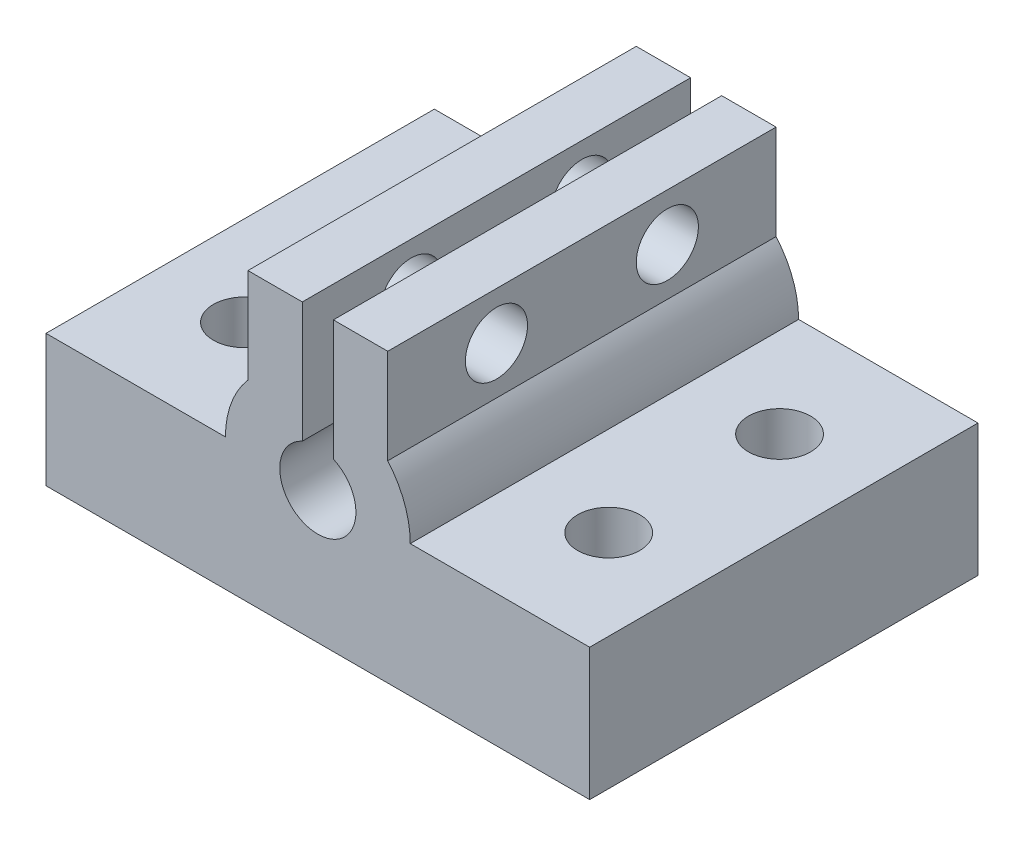
ISO-10303-21;
HEADER;
FILE_DESCRIPTION(('STEP AP214'),'2;1');
FILE_NAME('part.step','',(''),(''),'','','');
FILE_SCHEMA(('AUTOMOTIVE_DESIGN { 1 0 10303 214 1 1 1 1 }'));
ENDSEC;
DATA;
#1=APPLICATION_CONTEXT('core data for automotive mechanical design processes');
#2=APPLICATION_PROTOCOL_DEFINITION('international standard','automotive_design',2000,#1);
#3=PRODUCT_CONTEXT('',#1,'mechanical');
#4=PRODUCT('Part','Part','',(#3));
#5=PRODUCT_RELATED_PRODUCT_CATEGORY('part','',(#4));
#6=PRODUCT_DEFINITION_FORMATION('','',#4);
#7=PRODUCT_DEFINITION_CONTEXT('part definition',#1,'design');
#8=PRODUCT_DEFINITION('design','',#6,#7);
#9=PRODUCT_DEFINITION_SHAPE('','',#8);
#10=(LENGTH_UNIT() NAMED_UNIT(*) SI_UNIT(.MILLI.,.METRE.));
#11=(NAMED_UNIT(*) PLANE_ANGLE_UNIT() SI_UNIT($,.RADIAN.));
#12=(NAMED_UNIT(*) SI_UNIT($,.STERADIAN.) SOLID_ANGLE_UNIT());
#13=UNCERTAINTY_MEASURE_WITH_UNIT(LENGTH_MEASURE(1.E-05),#10,'distance_accuracy_value','');
#14=(GEOMETRIC_REPRESENTATION_CONTEXT(3) GLOBAL_UNCERTAINTY_ASSIGNED_CONTEXT((#13)) GLOBAL_UNIT_ASSIGNED_CONTEXT((#10,
#11,#12)) REPRESENTATION_CONTEXT('',''));
#15=CARTESIAN_POINT('',(0.,0.,0.));
#16=DIRECTION('',(0.,0.,1.));
#17=DIRECTION('',(1.,0.,0.));
#18=AXIS2_PLACEMENT_3D('',#15,#16,#17);
#19=CARTESIAN_POINT('',(0.,8.5,25.));
#20=DIRECTION('',(1.,0.,0.));
#21=DIRECTION('',(0.,1.,0.));
#22=AXIS2_PLACEMENT_3D('',#19,#20,#21);
#23=PLANE('',#22);
#24=DIRECTION('',(0.,-1.,0.));
#25=VECTOR('',#24,1.);
#26=CARTESIAN_POINT('',(0.,8.5,0.));
#27=LINE('',#26,#25);
#28=CARTESIAN_POINT('',(0.,8.5,0.));
#29=VERTEX_POINT('',#28);
#30=CARTESIAN_POINT('',(0.,0.,0.));
#31=VERTEX_POINT('',#30);
#32=EDGE_CURVE('E165',#29,#31,#27,.T.);
#33=ORIENTED_EDGE('',*,*,#32,.T.);
#34=DIRECTION('',(0.,0.,-1.));
#35=VECTOR('',#34,1.);
#36=CARTESIAN_POINT('',(0.,0.,25.));
#37=LINE('',#36,#35);
#38=CARTESIAN_POINT('',(0.,0.,25.));
#39=VERTEX_POINT('',#38);
#40=EDGE_CURVE('E11',#39,#31,#37,.T.);
#41=ORIENTED_EDGE('',*,*,#40,.F.);
#42=DIRECTION('',(0.,-1.,0.));
#43=VECTOR('',#42,1.);
#44=CARTESIAN_POINT('',(0.,8.5,25.));
#45=LINE('',#44,#43);
#46=CARTESIAN_POINT('',(0.,8.5,25.));
#47=VERTEX_POINT('',#46);
#48=EDGE_CURVE('E192',#47,#39,#45,.T.);
#49=ORIENTED_EDGE('',*,*,#48,.F.);
#50=DIRECTION('',(0.,0.,-1.));
#51=VECTOR('',#50,1.);
#52=CARTESIAN_POINT('',(0.,8.5,25.));
#53=LINE('',#52,#51);
#54=EDGE_CURVE('E161',#47,#29,#53,.T.);
#55=ORIENTED_EDGE('',*,*,#54,.T.);
#56=EDGE_LOOP('',(#33,#41,#49,#55));
#57=FACE_BOUND('',#56,.T.);
#58=ADVANCED_FACE('F33',(#57),#23,.F.);
#59=CARTESIAN_POINT('',(0.,0.,25.));
#60=DIRECTION('',(0.,1.,0.));
#61=DIRECTION('',(0.,0.,1.));
#62=AXIS2_PLACEMENT_3D('',#59,#60,#61);
#63=PLANE('',#62);
#64=CARTESIAN_POINT('',(5.775,0.,18.));
#65=DIRECTION('',(0.,1.,0.));
#66=DIRECTION('',(0.,0.,1.));
#67=AXIS2_PLACEMENT_3D('',#64,#65,#66);
#68=CIRCLE('',#67,2.);
#69=CARTESIAN_POINT('',(5.775,0.,20.));
#70=VERTEX_POINT('',#69);
#71=EDGE_CURVE('E461',#70,#70,#68,.F.);
#72=ORIENTED_EDGE('',*,*,#71,.F.);
#73=EDGE_LOOP('',(#72));
#74=FACE_BOUND('',#73,.T.);
#75=CARTESIAN_POINT('',(5.775,0.,7.));
#76=DIRECTION('',(0.,1.,0.));
#77=DIRECTION('',(0.,0.,1.));
#78=AXIS2_PLACEMENT_3D('',#75,#76,#77);
#79=CIRCLE('',#78,2.);
#80=CARTESIAN_POINT('',(5.775,0.,9.));
#81=VERTEX_POINT('',#80);
#82=EDGE_CURVE('E465',#81,#81,#79,.F.);
#83=ORIENTED_EDGE('',*,*,#82,.F.);
#84=EDGE_LOOP('',(#83));
#85=FACE_BOUND('',#84,.T.);
#86=CARTESIAN_POINT('',(29.225,0.,7.));
#87=DIRECTION('',(0.,1.,0.));
#88=DIRECTION('',(0.,0.,1.));
#89=AXIS2_PLACEMENT_3D('',#86,#87,#88);
#90=CIRCLE('',#89,2.);
#91=CARTESIAN_POINT('',(29.225,0.,9.));
#92=VERTEX_POINT('',#91);
#93=EDGE_CURVE('E474',#92,#92,#90,.F.);
#94=ORIENTED_EDGE('',*,*,#93,.F.);
#95=EDGE_LOOP('',(#94));
#96=FACE_BOUND('',#95,.T.);
#97=CARTESIAN_POINT('',(29.225,0.,18.));
#98=DIRECTION('',(0.,1.,0.));
#99=DIRECTION('',(0.,0.,1.));
#100=AXIS2_PLACEMENT_3D('',#97,#98,#99);
#101=CIRCLE('',#100,2.);
#102=CARTESIAN_POINT('',(29.225,0.,20.));
#103=VERTEX_POINT('',#102);
#104=EDGE_CURVE('E480',#103,#103,#101,.F.);
#105=ORIENTED_EDGE('',*,*,#104,.F.);
#106=EDGE_LOOP('',(#105));
#107=FACE_BOUND('',#106,.T.);
#108=DIRECTION('',(1.,0.,0.));
#109=VECTOR('',#108,1.);
#110=CARTESIAN_POINT('',(0.,0.,0.));
#111=LINE('',#110,#109);
#112=CARTESIAN_POINT('',(35.,0.,0.));
#113=VERTEX_POINT('',#112);
#114=EDGE_CURVE('E168',#31,#113,#111,.T.);
#115=ORIENTED_EDGE('',*,*,#114,.T.);
#116=DIRECTION('',(0.,0.,-1.));
#117=VECTOR('',#116,1.);
#118=CARTESIAN_POINT('',(35.,0.,25.));
#119=LINE('',#118,#117);
#120=CARTESIAN_POINT('',(35.,0.,25.));
#121=VERTEX_POINT('',#120);
#122=EDGE_CURVE('E41',#121,#113,#119,.T.);
#123=ORIENTED_EDGE('',*,*,#122,.F.);
#124=DIRECTION('',(1.,0.,0.));
#125=VECTOR('',#124,1.);
#126=CARTESIAN_POINT('',(0.,0.,25.));
#127=LINE('',#126,#125);
#128=EDGE_CURVE('E110',#39,#121,#127,.T.);
#129=ORIENTED_EDGE('',*,*,#128,.F.);
#130=ORIENTED_EDGE('',*,*,#40,.T.);
#131=EDGE_LOOP('',(#115,#123,#129,#130));
#132=FACE_BOUND('',#131,.T.);
#133=ADVANCED_FACE('F283',(#74,#85,#96,#107,#132),#63,.F.);
#134=CARTESIAN_POINT('',(35.,0.,25.));
#135=DIRECTION('',(-1.,0.,0.));
#136=DIRECTION('',(0.,0.,1.));
#137=AXIS2_PLACEMENT_3D('',#134,#135,#136);
#138=PLANE('',#137);
#139=DIRECTION('',(0.,1.,0.));
#140=VECTOR('',#139,1.);
#141=CARTESIAN_POINT('',(35.,0.,0.));
#142=LINE('',#141,#140);
#143=CARTESIAN_POINT('',(35.,8.5,0.));
#144=VERTEX_POINT('',#143);
#145=EDGE_CURVE('E171',#113,#144,#142,.T.);
#146=ORIENTED_EDGE('',*,*,#145,.T.);
#147=DIRECTION('',(0.,0.,-1.));
#148=VECTOR('',#147,1.);
#149=CARTESIAN_POINT('',(35.,8.5,25.));
#150=LINE('',#149,#148);
#151=CARTESIAN_POINT('',(35.,8.5,25.));
#152=VERTEX_POINT('',#151);
#153=EDGE_CURVE('E217',#152,#144,#150,.T.);
#154=ORIENTED_EDGE('',*,*,#153,.F.);
#155=DIRECTION('',(0.,1.,0.));
#156=VECTOR('',#155,1.);
#157=CARTESIAN_POINT('',(35.,0.,25.));
#158=LINE('',#157,#156);
#159=EDGE_CURVE('E225',#121,#152,#158,.T.);
#160=ORIENTED_EDGE('',*,*,#159,.F.);
#161=ORIENTED_EDGE('',*,*,#122,.T.);
#162=EDGE_LOOP('',(#146,#154,#160,#161));
#163=FACE_BOUND('',#162,.T.);
#164=ADVANCED_FACE('F223',(#163),#138,.F.);
#165=CARTESIAN_POINT('',(35.,8.5,25.));
#166=DIRECTION('',(0.,-1.,0.));
#167=DIRECTION('',(1.,0.,0.));
#168=AXIS2_PLACEMENT_3D('',#165,#166,#167);
#169=PLANE('',#168);
#170=CARTESIAN_POINT('',(29.225,8.5,7.));
#171=DIRECTION('',(0.,1.,0.));
#172=DIRECTION('',(-1.,0.,0.));
#173=AXIS2_PLACEMENT_3D('',#170,#171,#172);
#174=CIRCLE('',#173,2.);
#175=CARTESIAN_POINT('',(27.225,8.5,7.));
#176=VERTEX_POINT('',#175);
#177=EDGE_CURVE('E471',#176,#176,#174,.T.);
#178=ORIENTED_EDGE('',*,*,#177,.F.);
#179=EDGE_LOOP('',(#178));
#180=FACE_BOUND('',#179,.T.);
#181=CARTESIAN_POINT('',(29.225,8.5,18.));
#182=DIRECTION('',(0.,1.,0.));
#183=DIRECTION('',(-1.,0.,0.));
#184=AXIS2_PLACEMENT_3D('',#181,#182,#183);
#185=CIRCLE('',#184,2.);
#186=CARTESIAN_POINT('',(27.225,8.5,18.));
#187=VERTEX_POINT('',#186);
#188=EDGE_CURVE('E477',#187,#187,#185,.T.);
#189=ORIENTED_EDGE('',*,*,#188,.F.);
#190=EDGE_LOOP('',(#189));
#191=FACE_BOUND('',#190,.T.);
#192=DIRECTION('',(-1.,0.,0.));
#193=VECTOR('',#192,1.);
#194=CARTESIAN_POINT('',(35.,8.5,0.));
#195=LINE('',#194,#193);
#196=CARTESIAN_POINT('',(23.45,8.5,0.));
#197=VERTEX_POINT('',#196);
#198=EDGE_CURVE('E173',#144,#197,#195,.T.);
#199=ORIENTED_EDGE('',*,*,#198,.T.);
#200=DIRECTION('',(0.,0.,-1.));
#201=VECTOR('',#200,1.);
#202=CARTESIAN_POINT('',(23.45,8.5,25.));
#203=LINE('',#202,#201);
#204=CARTESIAN_POINT('',(23.45,8.5,25.));
#205=VERTEX_POINT('',#204);
#206=EDGE_CURVE('E214',#205,#197,#203,.T.);
#207=ORIENTED_EDGE('',*,*,#206,.F.);
#208=DIRECTION('',(-1.,0.,0.));
#209=VECTOR('',#208,1.);
#210=CARTESIAN_POINT('',(35.,8.5,25.));
#211=LINE('',#210,#209);
#212=EDGE_CURVE('E243',#152,#205,#211,.T.);
#213=ORIENTED_EDGE('',*,*,#212,.F.);
#214=ORIENTED_EDGE('',*,*,#153,.T.);
#215=EDGE_LOOP('',(#199,#207,#213,#214));
#216=FACE_BOUND('',#215,.T.);
#217=ADVANCED_FACE('F234',(#180,#191,#216),#169,.F.);
#218=CARTESIAN_POINT('',(17.5,8.5,25.));
#219=DIRECTION('',(0.,0.,-1.));
#220=DIRECTION('',(-1.,0.,0.));
#221=AXIS2_PLACEMENT_3D('',#218,#219,#220);
#222=CYLINDRICAL_SURFACE('',#221,5.95);
#223=CARTESIAN_POINT('',(17.5,8.5,0.));
#224=DIRECTION('',(0.,0.,1.));
#225=DIRECTION('',(1.,0.,0.));
#226=AXIS2_PLACEMENT_3D('',#223,#224,#225);
#227=CIRCLE('',#226,5.95);
#228=CARTESIAN_POINT('',(22.,12.3926212248304,0.));
#229=VERTEX_POINT('',#228);
#230=EDGE_CURVE('E175',#197,#229,#227,.T.);
#231=ORIENTED_EDGE('',*,*,#230,.T.);
#232=DIRECTION('',(0.,0.,-1.));
#233=VECTOR('',#232,1.);
#234=CARTESIAN_POINT('',(22.,12.3926212248304,25.));
#235=LINE('',#234,#233);
#236=CARTESIAN_POINT('',(22.,12.3926212248304,25.));
#237=VERTEX_POINT('',#236);
#238=EDGE_CURVE('E211',#237,#229,#235,.T.);
#239=ORIENTED_EDGE('',*,*,#238,.F.);
#240=CARTESIAN_POINT('',(17.5,8.5,25.));
#241=DIRECTION('',(0.,0.,1.));
#242=DIRECTION('',(1.,0.,0.));
#243=AXIS2_PLACEMENT_3D('',#240,#241,#242);
#244=CIRCLE('',#243,5.95);
#245=EDGE_CURVE('E240',#205,#237,#244,.T.);
#246=ORIENTED_EDGE('',*,*,#245,.F.);
#247=ORIENTED_EDGE('',*,*,#206,.T.);
#248=EDGE_LOOP('',(#231,#239,#246,#247));
#249=FACE_BOUND('',#248,.T.);
#250=ADVANCED_FACE('F238',(#249),#222,.T.);
#251=CARTESIAN_POINT('',(22.,18.5,25.));
#252=DIRECTION('',(-1.,0.,0.));
#253=DIRECTION('',(0.,-1.,0.));
#254=AXIS2_PLACEMENT_3D('',#251,#252,#253);
#255=PLANE('',#254);
#256=CARTESIAN_POINT('',(22.,15.4463106124152,7.));
#257=DIRECTION('',(1.,0.,0.));
#258=DIRECTION('',(0.,1.,0.));
#259=AXIS2_PLACEMENT_3D('',#256,#257,#258);
#260=CIRCLE('',#259,2.);
#261=CARTESIAN_POINT('',(22.,17.4463106124152,7.));
#262=VERTEX_POINT('',#261);
#263=EDGE_CURVE('E483',#262,#262,#260,.T.);
#264=ORIENTED_EDGE('',*,*,#263,.F.);
#265=EDGE_LOOP('',(#264));
#266=FACE_BOUND('',#265,.T.);
#267=CARTESIAN_POINT('',(22.,15.4463106124152,18.));
#268=DIRECTION('',(1.,0.,0.));
#269=DIRECTION('',(0.,1.,0.));
#270=AXIS2_PLACEMENT_3D('',#267,#268,#269);
#271=CIRCLE('',#270,2.);
#272=CARTESIAN_POINT('',(22.,17.4463106124152,18.));
#273=VERTEX_POINT('',#272);
#274=EDGE_CURVE('E334',#273,#273,#271,.T.);
#275=ORIENTED_EDGE('',*,*,#274,.F.);
#276=EDGE_LOOP('',(#275));
#277=FACE_BOUND('',#276,.T.);
#278=DIRECTION('',(0.,1.,0.));
#279=VECTOR('',#278,1.);
#280=CARTESIAN_POINT('',(22.,18.5,0.));
#281=LINE('',#280,#279);
#282=CARTESIAN_POINT('',(22.,18.5,0.));
#283=VERTEX_POINT('',#282);
#284=EDGE_CURVE('E177',#229,#283,#281,.T.);
#285=ORIENTED_EDGE('',*,*,#284,.T.);
#286=DIRECTION('',(0.,0.,-1.));
#287=VECTOR('',#286,1.);
#288=CARTESIAN_POINT('',(22.,18.5,25.));
#289=LINE('',#288,#287);
#290=CARTESIAN_POINT('',(22.,18.5,25.));
#291=VERTEX_POINT('',#290);
#292=EDGE_CURVE('E208',#291,#283,#289,.T.);
#293=ORIENTED_EDGE('',*,*,#292,.F.);
#294=DIRECTION('',(0.,1.,0.));
#295=VECTOR('',#294,1.);
#296=CARTESIAN_POINT('',(22.,18.5,25.));
#297=LINE('',#296,#295);
#298=EDGE_CURVE('E242',#237,#291,#297,.T.);
#299=ORIENTED_EDGE('',*,*,#298,.F.);
#300=ORIENTED_EDGE('',*,*,#238,.T.);
#301=EDGE_LOOP('',(#285,#293,#299,#300));
#302=FACE_BOUND('',#301,.T.);
#303=ADVANCED_FACE('F300',(#266,#277,#302),#255,.F.);
#304=CARTESIAN_POINT('',(18.5,18.5,25.));
#305=DIRECTION('',(0.,-1.,0.));
#306=DIRECTION('',(1.,0.,0.));
#307=AXIS2_PLACEMENT_3D('',#304,#305,#306);
#308=PLANE('',#307);
#309=DIRECTION('',(-1.,0.,0.));
#310=VECTOR('',#309,1.);
#311=CARTESIAN_POINT('',(18.5,18.5,0.));
#312=LINE('',#311,#310);
#313=CARTESIAN_POINT('',(18.5,18.5,0.));
#314=VERTEX_POINT('',#313);
#315=EDGE_CURVE('E179',#283,#314,#312,.T.);
#316=ORIENTED_EDGE('',*,*,#315,.T.);
#317=DIRECTION('',(0.,0.,-1.));
#318=VECTOR('',#317,1.);
#319=CARTESIAN_POINT('',(18.5,18.5,25.));
#320=LINE('',#319,#318);
#321=CARTESIAN_POINT('',(18.5,18.5,25.));
#322=VERTEX_POINT('',#321);
#323=EDGE_CURVE('E205',#322,#314,#320,.T.);
#324=ORIENTED_EDGE('',*,*,#323,.F.);
#325=DIRECTION('',(-1.,0.,0.));
#326=VECTOR('',#325,1.);
#327=CARTESIAN_POINT('',(18.5,18.5,25.));
#328=LINE('',#327,#326);
#329=EDGE_CURVE('E245',#291,#322,#328,.T.);
#330=ORIENTED_EDGE('',*,*,#329,.F.);
#331=ORIENTED_EDGE('',*,*,#292,.T.);
#332=EDGE_LOOP('',(#316,#324,#330,#331));
#333=FACE_BOUND('',#332,.T.);
#334=ADVANCED_FACE('F303',(#333),#308,.F.);
#335=CARTESIAN_POINT('',(18.5,10.7366269246345,25.));
#336=DIRECTION('',(1.,0.,0.));
#337=DIRECTION('',(0.,1.,0.));
#338=AXIS2_PLACEMENT_3D('',#335,#336,#337);
#339=PLANE('',#338);
#340=CARTESIAN_POINT('',(18.5,15.4463106124152,7.));
#341=DIRECTION('',(1.,0.,0.));
#342=DIRECTION('',(0.,1.,0.));
#343=AXIS2_PLACEMENT_3D('',#340,#341,#342);
#344=CIRCLE('',#343,2.);
#345=CARTESIAN_POINT('',(18.5,17.4463106124152,7.));
#346=VERTEX_POINT('',#345);
#347=EDGE_CURVE('E339',#346,#346,#344,.T.);
#348=ORIENTED_EDGE('',*,*,#347,.T.);
#349=EDGE_LOOP('',(#348));
#350=FACE_BOUND('',#349,.T.);
#351=CARTESIAN_POINT('',(18.5,15.4463106124152,18.));
#352=DIRECTION('',(1.,0.,0.));
#353=DIRECTION('',(0.,1.,0.));
#354=AXIS2_PLACEMENT_3D('',#351,#352,#353);
#355=CIRCLE('',#354,2.);
#356=CARTESIAN_POINT('',(18.5,17.4463106124152,18.));
#357=VERTEX_POINT('',#356);
#358=EDGE_CURVE('E169',#357,#357,#355,.T.);
#359=ORIENTED_EDGE('',*,*,#358,.T.);
#360=EDGE_LOOP('',(#359));
#361=FACE_BOUND('',#360,.T.);
#362=DIRECTION('',(0.,-1.,0.));
#363=VECTOR('',#362,1.);
#364=CARTESIAN_POINT('',(18.5,10.7366269246345,0.));
#365=LINE('',#364,#363);
#366=CARTESIAN_POINT('',(18.5,10.7366269246345,0.));
#367=VERTEX_POINT('',#366);
#368=EDGE_CURVE('E181',#314,#367,#365,.T.);
#369=ORIENTED_EDGE('',*,*,#368,.T.);
#370=DIRECTION('',(0.,0.,-1.));
#371=VECTOR('',#370,1.);
#372=CARTESIAN_POINT('',(18.5,10.7366269246345,25.));
#373=LINE('',#372,#371);
#374=CARTESIAN_POINT('',(18.5,10.7366269246345,25.));
#375=VERTEX_POINT('',#374);
#376=EDGE_CURVE('E202',#375,#367,#373,.T.);
#377=ORIENTED_EDGE('',*,*,#376,.F.);
#378=DIRECTION('',(0.,-1.,0.));
#379=VECTOR('',#378,1.);
#380=CARTESIAN_POINT('',(18.5,10.7366269246345,25.));
#381=LINE('',#380,#379);
#382=EDGE_CURVE('E251',#322,#375,#381,.T.);
#383=ORIENTED_EDGE('',*,*,#382,.F.);
#384=ORIENTED_EDGE('',*,*,#323,.T.);
#385=EDGE_LOOP('',(#369,#377,#383,#384));
#386=FACE_BOUND('',#385,.T.);
#387=ADVANCED_FACE('F307',(#350,#361,#386),#339,.F.);
#388=CARTESIAN_POINT('',(17.5,8.5,25.));
#389=DIRECTION('',(0.,0.,-1.));
#390=DIRECTION('',(-1.,0.,0.));
#391=AXIS2_PLACEMENT_3D('',#388,#389,#390);
#392=CYLINDRICAL_SURFACE('',#391,2.45);
#393=CARTESIAN_POINT('',(17.5,8.5,0.));
#394=DIRECTION('',(0.,0.,-1.));
#395=DIRECTION('',(1.,0.,0.));
#396=AXIS2_PLACEMENT_3D('',#393,#394,#395);
#397=CIRCLE('',#396,2.45);
#398=CARTESIAN_POINT('',(16.5,10.7366269246345,0.));
#399=VERTEX_POINT('',#398);
#400=EDGE_CURVE('E183',#367,#399,#397,.T.);
#401=ORIENTED_EDGE('',*,*,#400,.T.);
#402=DIRECTION('',(0.,0.,-1.));
#403=VECTOR('',#402,1.);
#404=CARTESIAN_POINT('',(16.5,10.7366269246345,25.));
#405=LINE('',#404,#403);
#406=CARTESIAN_POINT('',(16.5,10.7366269246345,25.));
#407=VERTEX_POINT('',#406);
#408=EDGE_CURVE('E199',#407,#399,#405,.T.);
#409=ORIENTED_EDGE('',*,*,#408,.F.);
#410=CARTESIAN_POINT('',(17.5,8.5,25.));
#411=DIRECTION('',(0.,0.,-1.));
#412=DIRECTION('',(1.,0.,0.));
#413=AXIS2_PLACEMENT_3D('',#410,#411,#412);
#414=CIRCLE('',#413,2.45);
#415=EDGE_CURVE('E253',#375,#407,#414,.T.);
#416=ORIENTED_EDGE('',*,*,#415,.F.);
#417=ORIENTED_EDGE('',*,*,#376,.T.);
#418=EDGE_LOOP('',(#401,#409,#416,#417));
#419=FACE_BOUND('',#418,.T.);
#420=ADVANCED_FACE('F311',(#419),#392,.F.);
#421=CARTESIAN_POINT('',(16.5,18.5,25.));
#422=DIRECTION('',(-1.,0.,0.));
#423=DIRECTION('',(0.,-1.,0.));
#424=AXIS2_PLACEMENT_3D('',#421,#422,#423);
#425=PLANE('',#424);
#426=CARTESIAN_POINT('',(16.5,15.4463106124152,7.));
#427=DIRECTION('',(-1.,0.,0.));
#428=DIRECTION('',(0.,-1.,0.));
#429=AXIS2_PLACEMENT_3D('',#426,#427,#428);
#430=CIRCLE('',#429,2.);
#431=CARTESIAN_POINT('',(16.5,13.4463106124152,7.));
#432=VERTEX_POINT('',#431);
#433=EDGE_CURVE('E487',#432,#432,#430,.T.);
#434=ORIENTED_EDGE('',*,*,#433,.T.);
#435=EDGE_LOOP('',(#434));
#436=FACE_BOUND('',#435,.T.);
#437=CARTESIAN_POINT('',(16.5,15.4463106124152,18.));
#438=DIRECTION('',(-1.,0.,0.));
#439=DIRECTION('',(0.,-1.,0.));
#440=AXIS2_PLACEMENT_3D('',#437,#438,#439);
#441=CIRCLE('',#440,2.);
#442=CARTESIAN_POINT('',(16.5,13.4463106124152,18.));
#443=VERTEX_POINT('',#442);
#444=EDGE_CURVE('E333',#443,#443,#441,.T.);
#445=ORIENTED_EDGE('',*,*,#444,.T.);
#446=EDGE_LOOP('',(#445));
#447=FACE_BOUND('',#446,.T.);
#448=DIRECTION('',(0.,1.,0.));
#449=VECTOR('',#448,1.);
#450=CARTESIAN_POINT('',(16.5,18.5,0.));
#451=LINE('',#450,#449);
#452=CARTESIAN_POINT('',(16.5,18.5,0.));
#453=VERTEX_POINT('',#452);
#454=EDGE_CURVE('E185',#399,#453,#451,.T.);
#455=ORIENTED_EDGE('',*,*,#454,.T.);
#456=DIRECTION('',(0.,0.,-1.));
#457=VECTOR('',#456,1.);
#458=CARTESIAN_POINT('',(16.5,18.5,25.));
#459=LINE('',#458,#457);
#460=CARTESIAN_POINT('',(16.5,18.5,25.));
#461=VERTEX_POINT('',#460);
#462=EDGE_CURVE('E196',#461,#453,#459,.T.);
#463=ORIENTED_EDGE('',*,*,#462,.F.);
#464=DIRECTION('',(0.,1.,0.));
#465=VECTOR('',#464,1.);
#466=CARTESIAN_POINT('',(16.5,18.5,25.));
#467=LINE('',#466,#465);
#468=EDGE_CURVE('E255',#407,#461,#467,.T.);
#469=ORIENTED_EDGE('',*,*,#468,.F.);
#470=ORIENTED_EDGE('',*,*,#408,.T.);
#471=EDGE_LOOP('',(#455,#463,#469,#470));
#472=FACE_BOUND('',#471,.T.);
#473=ADVANCED_FACE('F261',(#436,#447,#472),#425,.F.);
#474=CARTESIAN_POINT('',(13.,18.5,25.));
#475=DIRECTION('',(0.,-1.,0.));
#476=DIRECTION('',(1.,0.,0.));
#477=AXIS2_PLACEMENT_3D('',#474,#475,#476);
#478=PLANE('',#477);
#479=DIRECTION('',(-1.,0.,0.));
#480=VECTOR('',#479,1.);
#481=CARTESIAN_POINT('',(13.,18.5,0.));
#482=LINE('',#481,#480);
#483=CARTESIAN_POINT('',(13.,18.5,0.));
#484=VERTEX_POINT('',#483);
#485=EDGE_CURVE('E187',#453,#484,#482,.T.);
#486=ORIENTED_EDGE('',*,*,#485,.T.);
#487=DIRECTION('',(0.,0.,-1.));
#488=VECTOR('',#487,1.);
#489=CARTESIAN_POINT('',(13.,18.5,25.));
#490=LINE('',#489,#488);
#491=CARTESIAN_POINT('',(13.,18.5,25.));
#492=VERTEX_POINT('',#491);
#493=EDGE_CURVE('E156',#492,#484,#490,.T.);
#494=ORIENTED_EDGE('',*,*,#493,.F.);
#495=DIRECTION('',(-1.,0.,0.));
#496=VECTOR('',#495,1.);
#497=CARTESIAN_POINT('',(13.,18.5,25.));
#498=LINE('',#497,#496);
#499=EDGE_CURVE('E147',#461,#492,#498,.T.);
#500=ORIENTED_EDGE('',*,*,#499,.F.);
#501=ORIENTED_EDGE('',*,*,#462,.T.);
#502=EDGE_LOOP('',(#486,#494,#500,#501));
#503=FACE_BOUND('',#502,.T.);
#504=ADVANCED_FACE('F265',(#503),#478,.F.);
#505=CARTESIAN_POINT('',(13.,12.3926212248304,25.));
#506=DIRECTION('',(1.,0.,0.));
#507=DIRECTION('',(0.,1.,0.));
#508=AXIS2_PLACEMENT_3D('',#505,#506,#507);
#509=PLANE('',#508);
#510=CARTESIAN_POINT('',(13.,15.4463106124152,7.));
#511=DIRECTION('',(1.,0.,0.));
#512=DIRECTION('',(0.,1.,0.));
#513=AXIS2_PLACEMENT_3D('',#510,#511,#512);
#514=CIRCLE('',#513,2.);
#515=CARTESIAN_POINT('',(13.,17.4463106124152,7.));
#516=VERTEX_POINT('',#515);
#517=EDGE_CURVE('E328',#516,#516,#514,.F.);
#518=ORIENTED_EDGE('',*,*,#517,.F.);
#519=EDGE_LOOP('',(#518));
#520=FACE_BOUND('',#519,.T.);
#521=CARTESIAN_POINT('',(13.,15.4463106124152,18.));
#522=DIRECTION('',(1.,0.,0.));
#523=DIRECTION('',(0.,1.,0.));
#524=AXIS2_PLACEMENT_3D('',#521,#522,#523);
#525=CIRCLE('',#524,2.);
#526=CARTESIAN_POINT('',(13.,17.4463106124152,18.));
#527=VERTEX_POINT('',#526);
#528=EDGE_CURVE('E331',#527,#527,#525,.F.);
#529=ORIENTED_EDGE('',*,*,#528,.F.);
#530=EDGE_LOOP('',(#529));
#531=FACE_BOUND('',#530,.T.);
#532=DIRECTION('',(0.,-1.,0.));
#533=VECTOR('',#532,1.);
#534=CARTESIAN_POINT('',(13.,12.3926212248304,0.));
#535=LINE('',#534,#533);
#536=CARTESIAN_POINT('',(13.,12.3926212248304,0.));
#537=VERTEX_POINT('',#536);
#538=EDGE_CURVE('E155',#484,#537,#535,.T.);
#539=ORIENTED_EDGE('',*,*,#538,.T.);
#540=DIRECTION('',(0.,0.,-1.));
#541=VECTOR('',#540,1.);
#542=CARTESIAN_POINT('',(13.,12.3926212248304,25.));
#543=LINE('',#542,#541);
#544=CARTESIAN_POINT('',(13.,12.3926212248304,25.));
#545=VERTEX_POINT('',#544);
#546=EDGE_CURVE('E152',#545,#537,#543,.T.);
#547=ORIENTED_EDGE('',*,*,#546,.F.);
#548=DIRECTION('',(0.,-1.,0.));
#549=VECTOR('',#548,1.);
#550=CARTESIAN_POINT('',(13.,12.3926212248304,25.));
#551=LINE('',#550,#549);
#552=EDGE_CURVE('E141',#492,#545,#551,.T.);
#553=ORIENTED_EDGE('',*,*,#552,.F.);
#554=ORIENTED_EDGE('',*,*,#493,.T.);
#555=EDGE_LOOP('',(#539,#547,#553,#554));
#556=FACE_BOUND('',#555,.T.);
#557=ADVANCED_FACE('F153',(#520,#531,#556),#509,.F.);
#558=CARTESIAN_POINT('',(17.5,8.5,25.));
#559=DIRECTION('',(0.,0.,-1.));
#560=DIRECTION('',(-1.,0.,0.));
#561=AXIS2_PLACEMENT_3D('',#558,#559,#560);
#562=CYLINDRICAL_SURFACE('',#561,5.95);
#563=CARTESIAN_POINT('',(17.5,8.5,0.));
#564=DIRECTION('',(0.,0.,1.));
#565=DIRECTION('',(1.,0.,0.));
#566=AXIS2_PLACEMENT_3D('',#563,#564,#565);
#567=CIRCLE('',#566,5.95);
#568=CARTESIAN_POINT('',(11.55,8.5,0.));
#569=VERTEX_POINT('',#568);
#570=EDGE_CURVE('E96',#537,#569,#567,.T.);
#571=ORIENTED_EDGE('',*,*,#570,.T.);
#572=DIRECTION('',(0.,0.,-1.));
#573=VECTOR('',#572,1.);
#574=CARTESIAN_POINT('',(11.55,8.5,25.));
#575=LINE('',#574,#573);
#576=CARTESIAN_POINT('',(11.55,8.5,25.));
#577=VERTEX_POINT('',#576);
#578=EDGE_CURVE('E157',#577,#569,#575,.T.);
#579=ORIENTED_EDGE('',*,*,#578,.F.);
#580=CARTESIAN_POINT('',(17.5,8.5,25.));
#581=DIRECTION('',(0.,0.,1.));
#582=DIRECTION('',(1.,0.,0.));
#583=AXIS2_PLACEMENT_3D('',#580,#581,#582);
#584=CIRCLE('',#583,5.95);
#585=EDGE_CURVE('E145',#545,#577,#584,.T.);
#586=ORIENTED_EDGE('',*,*,#585,.F.);
#587=ORIENTED_EDGE('',*,*,#546,.T.);
#588=EDGE_LOOP('',(#571,#579,#586,#587));
#589=FACE_BOUND('',#588,.T.);
#590=ADVANCED_FACE('F159',(#589),#562,.T.);
#591=CARTESIAN_POINT('',(11.55,8.5,25.));
#592=DIRECTION('',(0.,-1.,0.));
#593=DIRECTION('',(1.,0.,0.));
#594=AXIS2_PLACEMENT_3D('',#591,#592,#593);
#595=PLANE('',#594);
#596=CARTESIAN_POINT('',(5.775,8.5,18.));
#597=DIRECTION('',(0.,1.,0.));
#598=DIRECTION('',(1.,0.,0.));
#599=AXIS2_PLACEMENT_3D('',#596,#597,#598);
#600=CIRCLE('',#599,2.);
#601=CARTESIAN_POINT('',(7.775,8.5,18.));
#602=VERTEX_POINT('',#601);
#603=EDGE_CURVE('E459',#602,#602,#600,.T.);
#604=ORIENTED_EDGE('',*,*,#603,.F.);
#605=EDGE_LOOP('',(#604));
#606=FACE_BOUND('',#605,.T.);
#607=CARTESIAN_POINT('',(5.775,8.5,7.));
#608=DIRECTION('',(0.,1.,0.));
#609=DIRECTION('',(1.,0.,0.));
#610=AXIS2_PLACEMENT_3D('',#607,#608,#609);
#611=CIRCLE('',#610,2.);
#612=CARTESIAN_POINT('',(7.775,8.5,7.));
#613=VERTEX_POINT('',#612);
#614=EDGE_CURVE('E462',#613,#613,#611,.T.);
#615=ORIENTED_EDGE('',*,*,#614,.F.);
#616=EDGE_LOOP('',(#615));
#617=FACE_BOUND('',#616,.T.);
#618=DIRECTION('',(-1.,0.,0.));
#619=VECTOR('',#618,1.);
#620=CARTESIAN_POINT('',(11.55,8.5,0.));
#621=LINE('',#620,#619);
#622=EDGE_CURVE('E102',#569,#29,#621,.T.);
#623=ORIENTED_EDGE('',*,*,#622,.T.);
#624=ORIENTED_EDGE('',*,*,#54,.F.);
#625=DIRECTION('',(-1.,0.,0.));
#626=VECTOR('',#625,1.);
#627=CARTESIAN_POINT('',(11.55,8.5,25.));
#628=LINE('',#627,#626);
#629=EDGE_CURVE('E49',#577,#47,#628,.T.);
#630=ORIENTED_EDGE('',*,*,#629,.F.);
#631=ORIENTED_EDGE('',*,*,#578,.T.);
#632=EDGE_LOOP('',(#623,#624,#630,#631));
#633=FACE_BOUND('',#632,.T.);
#634=ADVANCED_FACE('F269',(#606,#617,#633),#595,.F.);
#635=CARTESIAN_POINT('',(17.5,8.5,25.));
#636=DIRECTION('',(0.,0.,1.));
#637=DIRECTION('',(1.,0.,0.));
#638=AXIS2_PLACEMENT_3D('',#635,#636,#637);
#639=PLANE('',#638);
#640=ORIENTED_EDGE('',*,*,#48,.T.);
#641=ORIENTED_EDGE('',*,*,#128,.T.);
#642=ORIENTED_EDGE('',*,*,#159,.T.);
#643=ORIENTED_EDGE('',*,*,#212,.T.);
#644=ORIENTED_EDGE('',*,*,#245,.T.);
#645=ORIENTED_EDGE('',*,*,#298,.T.);
#646=ORIENTED_EDGE('',*,*,#329,.T.);
#647=ORIENTED_EDGE('',*,*,#382,.T.);
#648=ORIENTED_EDGE('',*,*,#415,.T.);
#649=ORIENTED_EDGE('',*,*,#468,.T.);
#650=ORIENTED_EDGE('',*,*,#499,.T.);
#651=ORIENTED_EDGE('',*,*,#552,.T.);
#652=ORIENTED_EDGE('',*,*,#585,.T.);
#653=ORIENTED_EDGE('',*,*,#629,.T.);
#654=EDGE_LOOP('',(#640,#641,#642,#643,#644,#645,#646,#647,#648,#649,#650,#651,#652,#653));
#655=FACE_BOUND('',#654,.T.);
#656=ADVANCED_FACE('F143',(#655),#639,.T.);
#657=CARTESIAN_POINT('',(17.5,8.5,0.));
#658=DIRECTION('',(0.,0.,1.));
#659=DIRECTION('',(1.,0.,0.));
#660=AXIS2_PLACEMENT_3D('',#657,#658,#659);
#661=PLANE('',#660);
#662=ORIENTED_EDGE('',*,*,#32,.F.);
#663=ORIENTED_EDGE('',*,*,#622,.F.);
#664=ORIENTED_EDGE('',*,*,#570,.F.);
#665=ORIENTED_EDGE('',*,*,#538,.F.);
#666=ORIENTED_EDGE('',*,*,#485,.F.);
#667=ORIENTED_EDGE('',*,*,#454,.F.);
#668=ORIENTED_EDGE('',*,*,#400,.F.);
#669=ORIENTED_EDGE('',*,*,#368,.F.);
#670=ORIENTED_EDGE('',*,*,#315,.F.);
#671=ORIENTED_EDGE('',*,*,#284,.F.);
#672=ORIENTED_EDGE('',*,*,#230,.F.);
#673=ORIENTED_EDGE('',*,*,#198,.F.);
#674=ORIENTED_EDGE('',*,*,#145,.F.);
#675=ORIENTED_EDGE('',*,*,#114,.F.);
#676=EDGE_LOOP('',(#662,#663,#664,#665,#666,#667,#668,#669,#670,#671,#672,#673,#674,#675));
#677=FACE_BOUND('',#676,.T.);
#678=ADVANCED_FACE('F229',(#677),#661,.F.);
#679=CARTESIAN_POINT('',(7.34314575050761,15.4463106124152,18.));
#680=DIRECTION('',(1.,0.,0.));
#681=DIRECTION('',(0.,1.,0.));
#682=AXIS2_PLACEMENT_3D('',#679,#680,#681);
#683=CYLINDRICAL_SURFACE('',#682,2.);
#684=ORIENTED_EDGE('',*,*,#528,.T.);
#685=EDGE_LOOP('',(#684));
#686=FACE_BOUND('',#685,.T.);
#687=ORIENTED_EDGE('',*,*,#444,.F.);
#688=EDGE_LOOP('',(#687));
#689=FACE_BOUND('',#688,.T.);
#690=ADVANCED_FACE('F353',(#686,#689),#683,.F.);
#691=ORIENTED_EDGE('',*,*,#274,.T.);
#692=EDGE_LOOP('',(#691));
#693=FACE_BOUND('',#692,.T.);
#694=ORIENTED_EDGE('',*,*,#358,.F.);
#695=EDGE_LOOP('',(#694));
#696=FACE_BOUND('',#695,.T.);
#697=ADVANCED_FACE('F350',(#693,#696),#683,.F.);
#698=CARTESIAN_POINT('',(7.34314575050761,15.4463106124152,7.));
#699=DIRECTION('',(1.,0.,0.));
#700=DIRECTION('',(0.,1.,0.));
#701=AXIS2_PLACEMENT_3D('',#698,#699,#700);
#702=CYLINDRICAL_SURFACE('',#701,2.);
#703=ORIENTED_EDGE('',*,*,#517,.T.);
#704=EDGE_LOOP('',(#703));
#705=FACE_BOUND('',#704,.T.);
#706=ORIENTED_EDGE('',*,*,#433,.F.);
#707=EDGE_LOOP('',(#706));
#708=FACE_BOUND('',#707,.T.);
#709=ADVANCED_FACE('F352',(#705,#708),#702,.F.);
#710=ORIENTED_EDGE('',*,*,#263,.T.);
#711=EDGE_LOOP('',(#710));
#712=FACE_BOUND('',#711,.T.);
#713=ORIENTED_EDGE('',*,*,#347,.F.);
#714=EDGE_LOOP('',(#713));
#715=FACE_BOUND('',#714,.T.);
#716=ADVANCED_FACE('F360',(#712,#715),#702,.F.);
#717=CARTESIAN_POINT('',(29.225,-0.001000000000001,18.));
#718=DIRECTION('',(0.,1.,0.));
#719=DIRECTION('',(-1.,0.,0.));
#720=AXIS2_PLACEMENT_3D('',#717,#718,#719);
#721=CYLINDRICAL_SURFACE('',#720,2.);
#722=ORIENTED_EDGE('',*,*,#188,.T.);
#723=EDGE_LOOP('',(#722));
#724=FACE_BOUND('',#723,.T.);
#725=ORIENTED_EDGE('',*,*,#104,.T.);
#726=EDGE_LOOP('',(#725));
#727=FACE_BOUND('',#726,.T.);
#728=ADVANCED_FACE('F395',(#724,#727),#721,.F.);
#729=CARTESIAN_POINT('',(29.225,-0.001000000000001,7.));
#730=DIRECTION('',(0.,1.,0.));
#731=DIRECTION('',(-1.,0.,0.));
#732=AXIS2_PLACEMENT_3D('',#729,#730,#731);
#733=CYLINDRICAL_SURFACE('',#732,2.);
#734=ORIENTED_EDGE('',*,*,#177,.T.);
#735=EDGE_LOOP('',(#734));
#736=FACE_BOUND('',#735,.T.);
#737=ORIENTED_EDGE('',*,*,#93,.T.);
#738=EDGE_LOOP('',(#737));
#739=FACE_BOUND('',#738,.T.);
#740=ADVANCED_FACE('F424',(#736,#739),#733,.F.);
#741=CARTESIAN_POINT('',(5.775,-0.0010000000000062,7.));
#742=DIRECTION('',(0.,1.,0.));
#743=DIRECTION('',(-1.,0.,0.));
#744=AXIS2_PLACEMENT_3D('',#741,#742,#743);
#745=CYLINDRICAL_SURFACE('',#744,2.);
#746=ORIENTED_EDGE('',*,*,#614,.T.);
#747=EDGE_LOOP('',(#746));
#748=FACE_BOUND('',#747,.T.);
#749=ORIENTED_EDGE('',*,*,#82,.T.);
#750=EDGE_LOOP('',(#749));
#751=FACE_BOUND('',#750,.T.);
#752=ADVANCED_FACE('F433',(#748,#751),#745,.F.);
#753=CARTESIAN_POINT('',(5.775,-0.0010000000000062,18.));
#754=DIRECTION('',(0.,1.,0.));
#755=DIRECTION('',(-1.,0.,0.));
#756=AXIS2_PLACEMENT_3D('',#753,#754,#755);
#757=CYLINDRICAL_SURFACE('',#756,2.);
#758=ORIENTED_EDGE('',*,*,#603,.T.);
#759=EDGE_LOOP('',(#758));
#760=FACE_BOUND('',#759,.T.);
#761=ORIENTED_EDGE('',*,*,#71,.T.);
#762=EDGE_LOOP('',(#761));
#763=FACE_BOUND('',#762,.T.);
#764=ADVANCED_FACE('F443',(#760,#763),#757,.F.);
#765=CLOSED_SHELL('',(#58,#133,#164,#217,#250,#303,#334,#387,#420,#473,#504,#557,#590,#634,#656,
#678,#690,#697,#709,#716,#728,#740,#752,#764));
#766=MANIFOLD_SOLID_BREP('B2',#765);
#767=ADVANCED_BREP_SHAPE_REPRESENTATION('',(#18,#766),#14);
#768=SHAPE_DEFINITION_REPRESENTATION(#9,#767);
ENDSEC;
END-ISO-10303-21;
